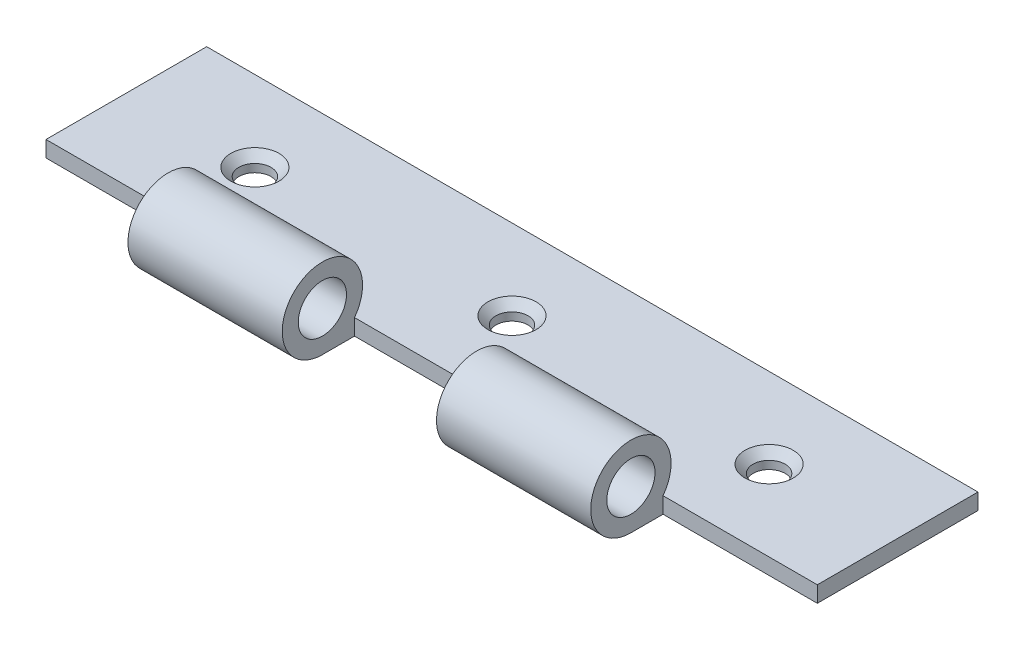
ISO-10303-21;
HEADER;
FILE_DESCRIPTION(('STEP AP214'),'2;1');
FILE_NAME('part.step','',(''),(''),'','','');
FILE_SCHEMA(('AUTOMOTIVE_DESIGN { 1 0 10303 214 1 1 1 1 }'));
ENDSEC;
DATA;
#1=APPLICATION_CONTEXT('core data for automotive mechanical design processes');
#2=APPLICATION_PROTOCOL_DEFINITION('international standard','automotive_design',2000,#1);
#3=PRODUCT_CONTEXT('',#1,'mechanical');
#4=PRODUCT('Part','Part','',(#3));
#5=PRODUCT_RELATED_PRODUCT_CATEGORY('part','',(#4));
#6=PRODUCT_DEFINITION_FORMATION('','',#4);
#7=PRODUCT_DEFINITION_CONTEXT('part definition',#1,'design');
#8=PRODUCT_DEFINITION('design','',#6,#7);
#9=PRODUCT_DEFINITION_SHAPE('','',#8);
#10=(LENGTH_UNIT() NAMED_UNIT(*) SI_UNIT(.MILLI.,.METRE.));
#11=(NAMED_UNIT(*) PLANE_ANGLE_UNIT() SI_UNIT($,.RADIAN.));
#12=(NAMED_UNIT(*) SI_UNIT($,.STERADIAN.) SOLID_ANGLE_UNIT());
#13=UNCERTAINTY_MEASURE_WITH_UNIT(LENGTH_MEASURE(1.E-05),#10,'distance_accuracy_value','');
#14=(GEOMETRIC_REPRESENTATION_CONTEXT(3) GLOBAL_UNCERTAINTY_ASSIGNED_CONTEXT((#13)) GLOBAL_UNIT_ASSIGNED_CONTEXT((#10,
#11,#12)) REPRESENTATION_CONTEXT('',''));
#15=CARTESIAN_POINT('',(0.,0.,0.));
#16=DIRECTION('',(0.,0.,1.));
#17=DIRECTION('',(1.,0.,0.));
#18=AXIS2_PLACEMENT_3D('',#15,#16,#17);
#19=CARTESIAN_POINT('',(-49.3253201513364,3.96875,9.525));
#20=DIRECTION('',(1.,0.,0.));
#21=DIRECTION('',(0.,0.,-1.));
#22=AXIS2_PLACEMENT_3D('',#19,#20,#21);
#23=CYLINDRICAL_SURFACE('',#22,3.96875);
#24=DIRECTION('',(1.,0.,0.));
#25=VECTOR('',#24,1.);
#26=CARTESIAN_POINT('',(-38.1,0.,9.525));
#27=LINE('',#26,#25);
#28=CARTESIAN_POINT('',(-22.86,0.,9.525));
#29=VERTEX_POINT('',#28);
#30=CARTESIAN_POINT('',(-7.61999999999998,0.,9.525));
#31=VERTEX_POINT('',#30);
#32=EDGE_CURVE('E139',#29,#31,#27,.T.);
#33=ORIENTED_EDGE('',*,*,#32,.T.);
#34=CARTESIAN_POINT('',(-7.61999999999998,3.96875,9.525));
#35=DIRECTION('',(1.,0.,0.));
#36=DIRECTION('',(0.,0.,-1.));
#37=AXIS2_PLACEMENT_3D('',#34,#35,#36);
#38=CIRCLE('',#37,3.96875);
#39=CARTESIAN_POINT('',(-7.61999999999998,1.5875,6.35));
#40=VERTEX_POINT('',#39);
#41=EDGE_CURVE('E121',#40,#31,#38,.T.);
#42=ORIENTED_EDGE('',*,*,#41,.F.);
#43=DIRECTION('',(1.,0.,0.));
#44=VECTOR('',#43,1.);
#45=CARTESIAN_POINT('',(-49.3253201513364,1.5875,6.35));
#46=LINE('',#45,#44);
#47=CARTESIAN_POINT('',(-22.86,1.5875,6.35));
#48=VERTEX_POINT('',#47);
#49=EDGE_CURVE('E275',#48,#40,#46,.T.);
#50=ORIENTED_EDGE('',*,*,#49,.F.);
#51=CARTESIAN_POINT('',(-22.86,3.96875,9.525));
#52=DIRECTION('',(1.,0.,0.));
#53=DIRECTION('',(0.,0.,-1.));
#54=AXIS2_PLACEMENT_3D('',#51,#52,#53);
#55=CIRCLE('',#54,3.96875);
#56=EDGE_CURVE('E145',#48,#29,#55,.T.);
#57=ORIENTED_EDGE('',*,*,#56,.T.);
#58=EDGE_LOOP('',(#33,#42,#50,#57));
#59=FACE_BOUND('',#58,.T.);
#60=ADVANCED_FACE('F41',(#59),#23,.T.);
#61=CARTESIAN_POINT('',(0.,0.,0.));
#62=DIRECTION('',(0.,-1.,0.));
#63=DIRECTION('',(0.,0.,-1.));
#64=AXIS2_PLACEMENT_3D('',#61,#62,#63);
#65=PLANE('',#64);
#66=CARTESIAN_POINT('',(0.,0.,-1.5875));
#67=DIRECTION('',(0.,1.,0.));
#68=DIRECTION('',(0.,0.,1.));
#69=AXIS2_PLACEMENT_3D('',#66,#67,#68);
#70=CIRCLE('',#69,1.5875);
#71=CARTESIAN_POINT('',(0.,0.,0.));
#72=VERTEX_POINT('',#71);
#73=EDGE_CURVE('E259',#72,#72,#70,.T.);
#74=ORIENTED_EDGE('',*,*,#73,.T.);
#75=EDGE_LOOP('',(#74));
#76=FACE_BOUND('',#75,.T.);
#77=CARTESIAN_POINT('',(-25.4,0.,-1.5875));
#78=DIRECTION('',(0.,1.,0.));
#79=DIRECTION('',(0.,0.,1.));
#80=AXIS2_PLACEMENT_3D('',#77,#78,#79);
#81=CIRCLE('',#80,1.5875);
#82=CARTESIAN_POINT('',(-25.4,0.,0.));
#83=VERTEX_POINT('',#82);
#84=EDGE_CURVE('E267',#83,#83,#81,.T.);
#85=ORIENTED_EDGE('',*,*,#84,.T.);
#86=EDGE_LOOP('',(#85));
#87=FACE_BOUND('',#86,.T.);
#88=CARTESIAN_POINT('',(25.4,0.,-1.5875));
#89=DIRECTION('',(0.,1.,0.));
#90=DIRECTION('',(0.,0.,1.));
#91=AXIS2_PLACEMENT_3D('',#88,#89,#90);
#92=CIRCLE('',#91,1.5875);
#93=CARTESIAN_POINT('',(25.4,0.,0.));
#94=VERTEX_POINT('',#93);
#95=EDGE_CURVE('E52',#94,#94,#92,.T.);
#96=ORIENTED_EDGE('',*,*,#95,.T.);
#97=EDGE_LOOP('',(#96));
#98=FACE_BOUND('',#97,.T.);
#99=DIRECTION('',(1.,0.,0.));
#100=VECTOR('',#99,1.);
#101=CARTESIAN_POINT('',(-7.61999999999998,0.,6.35));
#102=LINE('',#101,#100);
#103=CARTESIAN_POINT('',(-7.61999999999998,0.,6.35));
#104=VERTEX_POINT('',#103);
#105=CARTESIAN_POINT('',(7.62000000000002,0.,6.35));
#106=VERTEX_POINT('',#105);
#107=EDGE_CURVE('E141',#104,#106,#102,.T.);
#108=ORIENTED_EDGE('',*,*,#107,.F.);
#109=DIRECTION('',(0.,0.,-1.));
#110=VECTOR('',#109,1.);
#111=CARTESIAN_POINT('',(-7.61999999999998,0.,9.525));
#112=LINE('',#111,#110);
#113=EDGE_CURVE('E125',#31,#104,#112,.T.);
#114=ORIENTED_EDGE('',*,*,#113,.F.);
#115=ORIENTED_EDGE('',*,*,#32,.F.);
#116=DIRECTION('',(0.,0.,-1.));
#117=VECTOR('',#116,1.);
#118=CARTESIAN_POINT('',(-22.86,0.,9.525));
#119=LINE('',#118,#117);
#120=CARTESIAN_POINT('',(-22.86,0.,6.35));
#121=VERTEX_POINT('',#120);
#122=EDGE_CURVE('E297',#29,#121,#119,.T.);
#123=ORIENTED_EDGE('',*,*,#122,.T.);
#124=DIRECTION('',(1.,0.,0.));
#125=VECTOR('',#124,1.);
#126=CARTESIAN_POINT('',(-38.1,0.,6.35));
#127=LINE('',#126,#125);
#128=CARTESIAN_POINT('',(-38.1,0.,6.35));
#129=VERTEX_POINT('',#128);
#130=EDGE_CURVE('E225',#129,#121,#127,.T.);
#131=ORIENTED_EDGE('',*,*,#130,.F.);
#132=DIRECTION('',(0.,0.,1.));
#133=VECTOR('',#132,1.);
#134=CARTESIAN_POINT('',(-38.1,0.,9.525));
#135=LINE('',#134,#133);
#136=CARTESIAN_POINT('',(-38.1,0.,-9.525));
#137=VERTEX_POINT('',#136);
#138=EDGE_CURVE('E154',#137,#129,#135,.T.);
#139=ORIENTED_EDGE('',*,*,#138,.F.);
#140=DIRECTION('',(-1.,0.,0.));
#141=VECTOR('',#140,1.);
#142=CARTESIAN_POINT('',(-38.1,0.,-9.525));
#143=LINE('',#142,#141);
#144=CARTESIAN_POINT('',(38.1,0.,-9.525));
#145=VERTEX_POINT('',#144);
#146=EDGE_CURVE('E283',#145,#137,#143,.T.);
#147=ORIENTED_EDGE('',*,*,#146,.F.);
#148=DIRECTION('',(0.,0.,-1.));
#149=VECTOR('',#148,1.);
#150=CARTESIAN_POINT('',(38.1,0.,9.525));
#151=LINE('',#150,#149);
#152=CARTESIAN_POINT('',(38.1,0.,6.35));
#153=VERTEX_POINT('',#152);
#154=EDGE_CURVE('E274',#153,#145,#151,.T.);
#155=ORIENTED_EDGE('',*,*,#154,.F.);
#156=DIRECTION('',(1.,0.,0.));
#157=VECTOR('',#156,1.);
#158=CARTESIAN_POINT('',(22.86,0.,6.35));
#159=LINE('',#158,#157);
#160=CARTESIAN_POINT('',(22.86,0.,6.35));
#161=VERTEX_POINT('',#160);
#162=EDGE_CURVE('E231',#161,#153,#159,.T.);
#163=ORIENTED_EDGE('',*,*,#162,.F.);
#164=DIRECTION('',(0.,0.,-1.));
#165=VECTOR('',#164,1.);
#166=CARTESIAN_POINT('',(22.86,0.,9.525));
#167=LINE('',#166,#165);
#168=CARTESIAN_POINT('',(22.86,0.,9.525));
#169=VERTEX_POINT('',#168);
#170=EDGE_CURVE('E229',#169,#161,#167,.T.);
#171=ORIENTED_EDGE('',*,*,#170,.F.);
#172=CARTESIAN_POINT('',(7.62000000000002,0.,9.525));
#173=VERTEX_POINT('',#172);
#174=EDGE_CURVE('E148',#173,#169,#27,.T.);
#175=ORIENTED_EDGE('',*,*,#174,.F.);
#176=DIRECTION('',(0.,0.,-1.));
#177=VECTOR('',#176,1.);
#178=CARTESIAN_POINT('',(7.62000000000002,0.,9.525));
#179=LINE('',#178,#177);
#180=EDGE_CURVE('E224',#173,#106,#179,.T.);
#181=ORIENTED_EDGE('',*,*,#180,.T.);
#182=EDGE_LOOP('',(#108,#114,#115,#123,#131,#139,#147,#155,#163,#171,#175,#181));
#183=FACE_BOUND('',#182,.T.);
#184=ADVANCED_FACE('F137',(#76,#87,#98,#183),#65,.T.);
#185=CARTESIAN_POINT('',(7.62000000000002,3.96875,9.525));
#186=DIRECTION('',(1.,0.,0.));
#187=DIRECTION('',(0.,0.,-1.));
#188=AXIS2_PLACEMENT_3D('',#185,#186,#187);
#189=CIRCLE('',#188,3.96875);
#190=CARTESIAN_POINT('',(7.62000000000002,1.5875,6.35));
#191=VERTEX_POINT('',#190);
#192=EDGE_CURVE('E217',#191,#173,#189,.T.);
#193=ORIENTED_EDGE('',*,*,#192,.T.);
#194=ORIENTED_EDGE('',*,*,#174,.T.);
#195=CARTESIAN_POINT('',(22.86,3.96875,9.525));
#196=DIRECTION('',(1.,0.,0.));
#197=DIRECTION('',(0.,0.,-1.));
#198=AXIS2_PLACEMENT_3D('',#195,#196,#197);
#199=CIRCLE('',#198,3.96875);
#200=CARTESIAN_POINT('',(22.86,1.5875,6.35));
#201=VERTEX_POINT('',#200);
#202=EDGE_CURVE('E237',#201,#169,#199,.T.);
#203=ORIENTED_EDGE('',*,*,#202,.F.);
#204=EDGE_CURVE('E221',#191,#201,#46,.T.);
#205=ORIENTED_EDGE('',*,*,#204,.F.);
#206=EDGE_LOOP('',(#193,#194,#203,#205));
#207=FACE_BOUND('',#206,.T.);
#208=ADVANCED_FACE('F200',(#207),#23,.T.);
#209=CARTESIAN_POINT('',(-49.3253201513364,3.96875,9.525));
#210=DIRECTION('',(1.,0.,0.));
#211=DIRECTION('',(0.,0.,-1.));
#212=AXIS2_PLACEMENT_3D('',#209,#210,#211);
#213=CYLINDRICAL_SURFACE('',#212,2.38125);
#214=CARTESIAN_POINT('',(7.62000000000002,3.96875,9.525));
#215=DIRECTION('',(1.,0.,0.));
#216=DIRECTION('',(0.,0.,-1.));
#217=AXIS2_PLACEMENT_3D('',#214,#215,#216);
#218=CIRCLE('',#217,2.38125);
#219=CARTESIAN_POINT('',(7.62000000000002,3.96875,7.14375));
#220=VERTEX_POINT('',#219);
#221=EDGE_CURVE('E310',#220,#220,#218,.F.);
#222=ORIENTED_EDGE('',*,*,#221,.T.);
#223=EDGE_LOOP('',(#222));
#224=FACE_BOUND('',#223,.T.);
#225=CARTESIAN_POINT('',(22.86,3.96875,9.525));
#226=DIRECTION('',(1.,0.,0.));
#227=DIRECTION('',(0.,0.,-1.));
#228=AXIS2_PLACEMENT_3D('',#225,#226,#227);
#229=CIRCLE('',#228,2.38125);
#230=CARTESIAN_POINT('',(22.86,3.96875,7.14375));
#231=VERTEX_POINT('',#230);
#232=EDGE_CURVE('E46',#231,#231,#229,.F.);
#233=ORIENTED_EDGE('',*,*,#232,.F.);
#234=EDGE_LOOP('',(#233));
#235=FACE_BOUND('',#234,.T.);
#236=ADVANCED_FACE('F195',(#224,#235),#213,.F.);
#237=CARTESIAN_POINT('',(25.4,0.793750000000011,-1.5875));
#238=DIRECTION('',(0.,1.,0.));
#239=DIRECTION('',(0.,0.,1.));
#240=AXIS2_PLACEMENT_3D('',#237,#238,#239);
#241=CONICAL_SURFACE('',#240,1.5875,0.785398163397448);
#242=CARTESIAN_POINT('',(25.4,1.5875,-1.5875));
#243=DIRECTION('',(0.,-1.,0.));
#244=DIRECTION('',(0.,0.,-1.));
#245=AXIS2_PLACEMENT_3D('',#242,#243,#244);
#246=CIRCLE('',#245,2.38124999999999);
#247=CARTESIAN_POINT('',(25.4,1.5875,-3.96874999999998));
#248=VERTEX_POINT('',#247);
#249=EDGE_CURVE('E175',#248,#248,#246,.T.);
#250=ORIENTED_EDGE('',*,*,#249,.F.);
#251=EDGE_LOOP('',(#250));
#252=FACE_BOUND('',#251,.T.);
#253=CARTESIAN_POINT('',(25.4,0.793750000000011,-1.5875));
#254=DIRECTION('',(0.,-1.,0.));
#255=DIRECTION('',(0.,0.,-1.));
#256=AXIS2_PLACEMENT_3D('',#253,#254,#255);
#257=CIRCLE('',#256,1.5875);
#258=CARTESIAN_POINT('',(25.4,0.793750000000011,-3.175));
#259=VERTEX_POINT('',#258);
#260=EDGE_CURVE('E11',#259,#259,#257,.F.);
#261=ORIENTED_EDGE('',*,*,#260,.F.);
#262=EDGE_LOOP('',(#261));
#263=FACE_BOUND('',#262,.T.);
#264=ADVANCED_FACE('F44',(#252,#263),#241,.F.);
#265=CARTESIAN_POINT('',(25.4,0.,-1.5875));
#266=DIRECTION('',(0.,1.,0.));
#267=DIRECTION('',(0.,0.,1.));
#268=AXIS2_PLACEMENT_3D('',#265,#266,#267);
#269=CYLINDRICAL_SURFACE('',#268,1.5875);
#270=ORIENTED_EDGE('',*,*,#260,.T.);
#271=EDGE_LOOP('',(#270));
#272=FACE_BOUND('',#271,.T.);
#273=ORIENTED_EDGE('',*,*,#95,.F.);
#274=EDGE_LOOP('',(#273));
#275=FACE_BOUND('',#274,.T.);
#276=ADVANCED_FACE('F184',(#272,#275),#269,.F.);
#277=CARTESIAN_POINT('',(38.1,1.5875,9.525));
#278=DIRECTION('',(-1.,0.,0.));
#279=DIRECTION('',(0.,0.,1.));
#280=AXIS2_PLACEMENT_3D('',#277,#278,#279);
#281=PLANE('',#280);
#282=DIRECTION('',(0.,0.,-1.));
#283=VECTOR('',#282,1.);
#284=CARTESIAN_POINT('',(38.1,1.5875,9.525));
#285=LINE('',#284,#283);
#286=CARTESIAN_POINT('',(38.1,1.5875,6.35));
#287=VERTEX_POINT('',#286);
#288=CARTESIAN_POINT('',(38.1,1.5875,-9.525));
#289=VERTEX_POINT('',#288);
#290=EDGE_CURVE('E147',#287,#289,#285,.T.);
#291=ORIENTED_EDGE('',*,*,#290,.F.);
#292=DIRECTION('',(0.,1.,0.));
#293=VECTOR('',#292,1.);
#294=CARTESIAN_POINT('',(38.1,1.5875,6.35));
#295=LINE('',#294,#293);
#296=EDGE_CURVE('E242',#153,#287,#295,.T.);
#297=ORIENTED_EDGE('',*,*,#296,.F.);
#298=ORIENTED_EDGE('',*,*,#154,.T.);
#299=DIRECTION('',(0.,-1.,0.));
#300=VECTOR('',#299,1.);
#301=CARTESIAN_POINT('',(38.1,1.5875,-9.525));
#302=LINE('',#301,#300);
#303=EDGE_CURVE('E162',#289,#145,#302,.T.);
#304=ORIENTED_EDGE('',*,*,#303,.F.);
#305=EDGE_LOOP('',(#291,#297,#298,#304));
#306=FACE_BOUND('',#305,.T.);
#307=ADVANCED_FACE('F186',(#306),#281,.F.);
#308=CARTESIAN_POINT('',(-38.1,1.5875,-9.525));
#309=DIRECTION('',(0.,0.,1.));
#310=DIRECTION('',(1.,0.,0.));
#311=AXIS2_PLACEMENT_3D('',#308,#309,#310);
#312=PLANE('',#311);
#313=ORIENTED_EDGE('',*,*,#146,.T.);
#314=DIRECTION('',(0.,-1.,0.));
#315=VECTOR('',#314,1.);
#316=CARTESIAN_POINT('',(-38.1,1.5875,-9.525));
#317=LINE('',#316,#315);
#318=CARTESIAN_POINT('',(-38.1,1.5875,-9.525));
#319=VERTEX_POINT('',#318);
#320=EDGE_CURVE('E158',#319,#137,#317,.T.);
#321=ORIENTED_EDGE('',*,*,#320,.F.);
#322=DIRECTION('',(-1.,0.,0.));
#323=VECTOR('',#322,1.);
#324=CARTESIAN_POINT('',(-38.1,1.5875,-9.525));
#325=LINE('',#324,#323);
#326=EDGE_CURVE('E152',#289,#319,#325,.T.);
#327=ORIENTED_EDGE('',*,*,#326,.F.);
#328=ORIENTED_EDGE('',*,*,#303,.T.);
#329=EDGE_LOOP('',(#313,#321,#327,#328));
#330=FACE_BOUND('',#329,.T.);
#331=ADVANCED_FACE('F192',(#330),#312,.F.);
#332=CARTESIAN_POINT('',(-38.1,1.5875,9.525));
#333=DIRECTION('',(1.,0.,0.));
#334=DIRECTION('',(0.,0.,-1.));
#335=AXIS2_PLACEMENT_3D('',#332,#333,#334);
#336=PLANE('',#335);
#337=ORIENTED_EDGE('',*,*,#138,.T.);
#338=DIRECTION('',(0.,1.,0.));
#339=VECTOR('',#338,1.);
#340=CARTESIAN_POINT('',(-38.1,1.5875,6.35));
#341=LINE('',#340,#339);
#342=CARTESIAN_POINT('',(-38.1,1.5875,6.35));
#343=VERTEX_POINT('',#342);
#344=EDGE_CURVE('E295',#129,#343,#341,.T.);
#345=ORIENTED_EDGE('',*,*,#344,.T.);
#346=DIRECTION('',(0.,0.,1.));
#347=VECTOR('',#346,1.);
#348=CARTESIAN_POINT('',(-38.1,1.5875,9.525));
#349=LINE('',#348,#347);
#350=EDGE_CURVE('E163',#319,#343,#349,.T.);
#351=ORIENTED_EDGE('',*,*,#350,.F.);
#352=ORIENTED_EDGE('',*,*,#320,.T.);
#353=EDGE_LOOP('',(#337,#345,#351,#352));
#354=FACE_BOUND('',#353,.T.);
#355=ADVANCED_FACE('F293',(#354),#336,.F.);
#356=CARTESIAN_POINT('',(0.,1.5875,0.));
#357=DIRECTION('',(0.,-1.,0.));
#358=DIRECTION('',(0.,0.,-1.));
#359=AXIS2_PLACEMENT_3D('',#356,#357,#358);
#360=PLANE('',#359);
#361=CARTESIAN_POINT('',(0.,1.5875,-1.5875));
#362=DIRECTION('',(0.,-1.,0.));
#363=DIRECTION('',(0.,0.,-1.));
#364=AXIS2_PLACEMENT_3D('',#361,#362,#363);
#365=CIRCLE('',#364,2.38124999999999);
#366=CARTESIAN_POINT('',(0.,1.5875,-3.96874999999998));
#367=VERTEX_POINT('',#366);
#368=EDGE_CURVE('E255',#367,#367,#365,.T.);
#369=ORIENTED_EDGE('',*,*,#368,.T.);
#370=EDGE_LOOP('',(#369));
#371=FACE_BOUND('',#370,.T.);
#372=CARTESIAN_POINT('',(-25.4,1.5875,-1.5875));
#373=DIRECTION('',(0.,-1.,0.));
#374=DIRECTION('',(0.,0.,-1.));
#375=AXIS2_PLACEMENT_3D('',#372,#373,#374);
#376=CIRCLE('',#375,2.38124999999999);
#377=CARTESIAN_POINT('',(-25.4,1.5875,-3.96874999999998));
#378=VERTEX_POINT('',#377);
#379=EDGE_CURVE('E171',#378,#378,#376,.T.);
#380=ORIENTED_EDGE('',*,*,#379,.T.);
#381=EDGE_LOOP('',(#380));
#382=FACE_BOUND('',#381,.T.);
#383=ORIENTED_EDGE('',*,*,#350,.T.);
#384=EDGE_CURVE('E271',#343,#48,#46,.T.);
#385=ORIENTED_EDGE('',*,*,#384,.T.);
#386=ORIENTED_EDGE('',*,*,#49,.T.);
#387=DIRECTION('',(1.,0.,0.));
#388=VECTOR('',#387,1.);
#389=CARTESIAN_POINT('',(-7.61999999999998,1.5875,6.35));
#390=LINE('',#389,#388);
#391=EDGE_CURVE('E311',#40,#191,#390,.T.);
#392=ORIENTED_EDGE('',*,*,#391,.T.);
#393=ORIENTED_EDGE('',*,*,#204,.T.);
#394=DIRECTION('',(1.,0.,0.));
#395=VECTOR('',#394,1.);
#396=CARTESIAN_POINT('',(22.86,1.5875,6.35));
#397=LINE('',#396,#395);
#398=EDGE_CURVE('E249',#201,#287,#397,.T.);
#399=ORIENTED_EDGE('',*,*,#398,.T.);
#400=ORIENTED_EDGE('',*,*,#290,.T.);
#401=ORIENTED_EDGE('',*,*,#326,.T.);
#402=EDGE_LOOP('',(#383,#385,#386,#392,#393,#399,#400,#401));
#403=FACE_BOUND('',#402,.T.);
#404=ORIENTED_EDGE('',*,*,#249,.T.);
#405=EDGE_LOOP('',(#404));
#406=FACE_BOUND('',#405,.T.);
#407=ADVANCED_FACE('F332',(#371,#382,#403,#406),#360,.F.);
#408=CARTESIAN_POINT('',(-25.4,0.,-1.5875));
#409=DIRECTION('',(0.,1.,0.));
#410=DIRECTION('',(0.,0.,1.));
#411=AXIS2_PLACEMENT_3D('',#408,#409,#410);
#412=CYLINDRICAL_SURFACE('',#411,1.5875);
#413=CARTESIAN_POINT('',(-25.4,0.793750000000011,-1.5875));
#414=DIRECTION('',(0.,-1.,0.));
#415=DIRECTION('',(0.,0.,-1.));
#416=AXIS2_PLACEMENT_3D('',#413,#414,#415);
#417=CIRCLE('',#416,1.5875);
#418=CARTESIAN_POINT('',(-25.4,0.793750000000011,-3.175));
#419=VERTEX_POINT('',#418);
#420=EDGE_CURVE('E167',#419,#419,#417,.F.);
#421=ORIENTED_EDGE('',*,*,#420,.T.);
#422=EDGE_LOOP('',(#421));
#423=FACE_BOUND('',#422,.T.);
#424=ORIENTED_EDGE('',*,*,#84,.F.);
#425=EDGE_LOOP('',(#424));
#426=FACE_BOUND('',#425,.T.);
#427=ADVANCED_FACE('F328',(#423,#426),#412,.F.);
#428=CARTESIAN_POINT('',(-25.4,0.793750000000011,-1.5875));
#429=DIRECTION('',(0.,1.,0.));
#430=DIRECTION('',(0.,0.,1.));
#431=AXIS2_PLACEMENT_3D('',#428,#429,#430);
#432=CONICAL_SURFACE('',#431,1.5875,0.785398163397448);
#433=ORIENTED_EDGE('',*,*,#379,.F.);
#434=EDGE_LOOP('',(#433));
#435=FACE_BOUND('',#434,.T.);
#436=ORIENTED_EDGE('',*,*,#420,.F.);
#437=EDGE_LOOP('',(#436));
#438=FACE_BOUND('',#437,.T.);
#439=ADVANCED_FACE('F331',(#435,#438),#432,.F.);
#440=CARTESIAN_POINT('',(0.,0.,-1.5875));
#441=DIRECTION('',(0.,1.,0.));
#442=DIRECTION('',(0.,0.,1.));
#443=AXIS2_PLACEMENT_3D('',#440,#441,#442);
#444=CYLINDRICAL_SURFACE('',#443,1.5875);
#445=CARTESIAN_POINT('',(0.,0.793750000000011,-1.5875));
#446=DIRECTION('',(0.,-1.,0.));
#447=DIRECTION('',(0.,0.,-1.));
#448=AXIS2_PLACEMENT_3D('',#445,#446,#447);
#449=CIRCLE('',#448,1.5875);
#450=CARTESIAN_POINT('',(0.,0.793750000000011,-3.175));
#451=VERTEX_POINT('',#450);
#452=EDGE_CURVE('E263',#451,#451,#449,.F.);
#453=ORIENTED_EDGE('',*,*,#452,.T.);
#454=EDGE_LOOP('',(#453));
#455=FACE_BOUND('',#454,.T.);
#456=ORIENTED_EDGE('',*,*,#73,.F.);
#457=EDGE_LOOP('',(#456));
#458=FACE_BOUND('',#457,.T.);
#459=ADVANCED_FACE('F334',(#455,#458),#444,.F.);
#460=CARTESIAN_POINT('',(0.,0.793750000000011,-1.5875));
#461=DIRECTION('',(0.,1.,0.));
#462=DIRECTION('',(0.,0.,1.));
#463=AXIS2_PLACEMENT_3D('',#460,#461,#462);
#464=CONICAL_SURFACE('',#463,1.5875,0.785398163397448);
#465=ORIENTED_EDGE('',*,*,#368,.F.);
#466=EDGE_LOOP('',(#465));
#467=FACE_BOUND('',#466,.T.);
#468=ORIENTED_EDGE('',*,*,#452,.F.);
#469=EDGE_LOOP('',(#468));
#470=FACE_BOUND('',#469,.T.);
#471=ADVANCED_FACE('F337',(#467,#470),#464,.F.);
#472=CARTESIAN_POINT('',(22.86,3.96875,9.525));
#473=DIRECTION('',(1.,0.,0.));
#474=DIRECTION('',(0.,0.,-1.));
#475=AXIS2_PLACEMENT_3D('',#472,#473,#474);
#476=PLANE('',#475);
#477=ORIENTED_EDGE('',*,*,#202,.T.);
#478=ORIENTED_EDGE('',*,*,#170,.T.);
#479=DIRECTION('',(0.,1.,0.));
#480=VECTOR('',#479,1.);
#481=CARTESIAN_POINT('',(22.86,1.5875,6.35));
#482=LINE('',#481,#480);
#483=EDGE_CURVE('E236',#161,#201,#482,.T.);
#484=ORIENTED_EDGE('',*,*,#483,.T.);
#485=EDGE_LOOP('',(#477,#478,#484));
#486=FACE_BOUND('',#485,.T.);
#487=ORIENTED_EDGE('',*,*,#232,.T.);
#488=EDGE_LOOP('',(#487));
#489=FACE_BOUND('',#488,.T.);
#490=ADVANCED_FACE('F345',(#486,#489),#476,.T.);
#491=CARTESIAN_POINT('',(22.86,1.5875,6.35));
#492=DIRECTION('',(0.,0.,-1.));
#493=DIRECTION('',(0.,1.,0.));
#494=AXIS2_PLACEMENT_3D('',#491,#492,#493);
#495=PLANE('',#494);
#496=ORIENTED_EDGE('',*,*,#296,.T.);
#497=ORIENTED_EDGE('',*,*,#398,.F.);
#498=ORIENTED_EDGE('',*,*,#483,.F.);
#499=ORIENTED_EDGE('',*,*,#162,.T.);
#500=EDGE_LOOP('',(#496,#497,#498,#499));
#501=FACE_BOUND('',#500,.T.);
#502=ADVANCED_FACE('F347',(#501),#495,.F.);
#503=CARTESIAN_POINT('',(-22.86,3.96875,9.525));
#504=DIRECTION('',(1.,0.,0.));
#505=DIRECTION('',(0.,0.,-1.));
#506=AXIS2_PLACEMENT_3D('',#503,#504,#505);
#507=PLANE('',#506);
#508=ORIENTED_EDGE('',*,*,#56,.F.);
#509=DIRECTION('',(0.,1.,0.));
#510=VECTOR('',#509,1.);
#511=CARTESIAN_POINT('',(-22.86,1.5875,6.35));
#512=LINE('',#511,#510);
#513=EDGE_CURVE('E67',#121,#48,#512,.T.);
#514=ORIENTED_EDGE('',*,*,#513,.F.);
#515=ORIENTED_EDGE('',*,*,#122,.F.);
#516=EDGE_LOOP('',(#508,#514,#515));
#517=FACE_BOUND('',#516,.T.);
#518=CARTESIAN_POINT('',(-22.86,3.96875,9.525));
#519=DIRECTION('',(1.,0.,0.));
#520=DIRECTION('',(0.,0.,-1.));
#521=AXIS2_PLACEMENT_3D('',#518,#519,#520);
#522=CIRCLE('',#521,2.38125);
#523=CARTESIAN_POINT('',(-22.86,3.96875,7.14375));
#524=VERTEX_POINT('',#523);
#525=EDGE_CURVE('E306',#524,#524,#522,.F.);
#526=ORIENTED_EDGE('',*,*,#525,.F.);
#527=EDGE_LOOP('',(#526));
#528=FACE_BOUND('',#527,.T.);
#529=ADVANCED_FACE('F350',(#517,#528),#507,.F.);
#530=CARTESIAN_POINT('',(-38.1,1.5875,6.35));
#531=DIRECTION('',(0.,0.,-1.));
#532=DIRECTION('',(0.,1.,0.));
#533=AXIS2_PLACEMENT_3D('',#530,#531,#532);
#534=PLANE('',#533);
#535=ORIENTED_EDGE('',*,*,#513,.T.);
#536=ORIENTED_EDGE('',*,*,#384,.F.);
#537=ORIENTED_EDGE('',*,*,#344,.F.);
#538=ORIENTED_EDGE('',*,*,#130,.T.);
#539=EDGE_LOOP('',(#535,#536,#537,#538));
#540=FACE_BOUND('',#539,.T.);
#541=ADVANCED_FACE('F354',(#540),#534,.F.);
#542=CARTESIAN_POINT('',(-7.61999999999998,3.96875,9.525));
#543=DIRECTION('',(1.,0.,0.));
#544=DIRECTION('',(0.,0.,-1.));
#545=AXIS2_PLACEMENT_3D('',#542,#543,#544);
#546=PLANE('',#545);
#547=ORIENTED_EDGE('',*,*,#41,.T.);
#548=ORIENTED_EDGE('',*,*,#113,.T.);
#549=DIRECTION('',(0.,1.,0.));
#550=VECTOR('',#549,1.);
#551=CARTESIAN_POINT('',(-7.61999999999998,1.5875,6.35));
#552=LINE('',#551,#550);
#553=EDGE_CURVE('E127',#104,#40,#552,.T.);
#554=ORIENTED_EDGE('',*,*,#553,.T.);
#555=EDGE_LOOP('',(#547,#548,#554));
#556=FACE_BOUND('',#555,.T.);
#557=CARTESIAN_POINT('',(-7.61999999999998,3.96875,9.525));
#558=DIRECTION('',(1.,0.,0.));
#559=DIRECTION('',(0.,0.,-1.));
#560=AXIS2_PLACEMENT_3D('',#557,#558,#559);
#561=CIRCLE('',#560,2.38125);
#562=CARTESIAN_POINT('',(-7.61999999999998,3.96875,7.14375));
#563=VERTEX_POINT('',#562);
#564=EDGE_CURVE('E248',#563,#563,#561,.F.);
#565=ORIENTED_EDGE('',*,*,#564,.T.);
#566=EDGE_LOOP('',(#565));
#567=FACE_BOUND('',#566,.T.);
#568=ADVANCED_FACE('F123',(#556,#567),#546,.T.);
#569=CARTESIAN_POINT('',(7.62000000000002,3.96875,9.525));
#570=DIRECTION('',(1.,0.,0.));
#571=DIRECTION('',(0.,0.,-1.));
#572=AXIS2_PLACEMENT_3D('',#569,#570,#571);
#573=PLANE('',#572);
#574=ORIENTED_EDGE('',*,*,#192,.F.);
#575=DIRECTION('',(0.,1.,0.));
#576=VECTOR('',#575,1.);
#577=CARTESIAN_POINT('',(7.62000000000002,1.5875,6.35));
#578=LINE('',#577,#576);
#579=EDGE_CURVE('E59',#106,#191,#578,.T.);
#580=ORIENTED_EDGE('',*,*,#579,.F.);
#581=ORIENTED_EDGE('',*,*,#180,.F.);
#582=EDGE_LOOP('',(#574,#580,#581));
#583=FACE_BOUND('',#582,.T.);
#584=ORIENTED_EDGE('',*,*,#221,.F.);
#585=EDGE_LOOP('',(#584));
#586=FACE_BOUND('',#585,.T.);
#587=ADVANCED_FACE('F324',(#583,#586),#573,.F.);
#588=CARTESIAN_POINT('',(-7.61999999999998,1.5875,6.35));
#589=DIRECTION('',(0.,0.,-1.));
#590=DIRECTION('',(0.,1.,0.));
#591=AXIS2_PLACEMENT_3D('',#588,#589,#590);
#592=PLANE('',#591);
#593=ORIENTED_EDGE('',*,*,#579,.T.);
#594=ORIENTED_EDGE('',*,*,#391,.F.);
#595=ORIENTED_EDGE('',*,*,#553,.F.);
#596=ORIENTED_EDGE('',*,*,#107,.T.);
#597=EDGE_LOOP('',(#593,#594,#595,#596));
#598=FACE_BOUND('',#597,.T.);
#599=ADVANCED_FACE('F319',(#598),#592,.F.);
#600=ORIENTED_EDGE('',*,*,#525,.T.);
#601=EDGE_LOOP('',(#600));
#602=FACE_BOUND('',#601,.T.);
#603=ORIENTED_EDGE('',*,*,#564,.F.);
#604=EDGE_LOOP('',(#603));
#605=FACE_BOUND('',#604,.T.);
#606=ADVANCED_FACE('F214',(#602,#605),#213,.F.);
#607=CLOSED_SHELL('',(#60,#184,#208,#236,#264,#276,#307,#331,#355,#407,#427,#439,#459,#471,#490,
#502,#529,#541,#568,#587,#599,#606));
#608=MANIFOLD_SOLID_BREP('B2',#607);
#609=ADVANCED_BREP_SHAPE_REPRESENTATION('',(#18,#608),#14);
#610=SHAPE_DEFINITION_REPRESENTATION(#9,#609);
ENDSEC;
END-ISO-10303-21;
